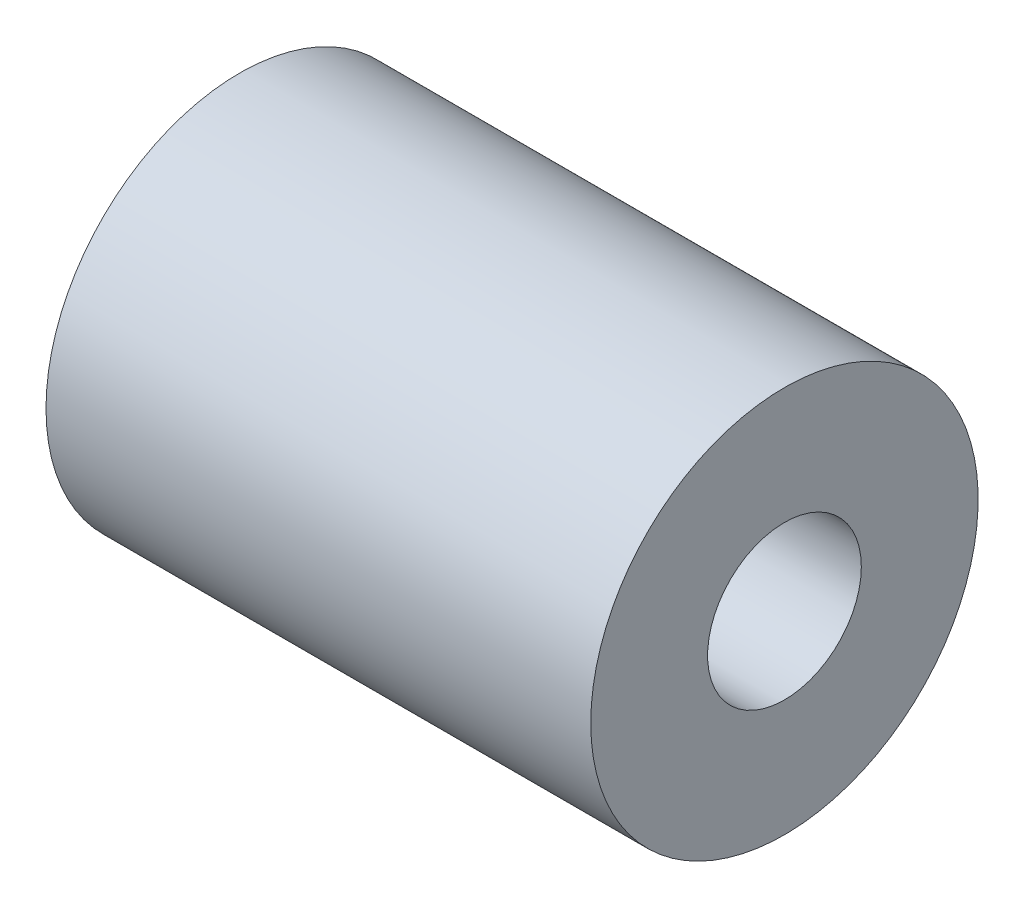
ISO-10303-21;
HEADER;
FILE_DESCRIPTION(('STEP AP214'),'2;1');
FILE_NAME('part.step','',(''),(''),'','','');
FILE_SCHEMA(('AUTOMOTIVE_DESIGN { 1 0 10303 214 1 1 1 1 }'));
ENDSEC;
DATA;
#1=APPLICATION_CONTEXT('core data for automotive mechanical design processes');
#2=APPLICATION_PROTOCOL_DEFINITION('international standard','automotive_design',2000,#1);
#3=PRODUCT_CONTEXT('',#1,'mechanical');
#4=PRODUCT('Part','Part','',(#3));
#5=PRODUCT_RELATED_PRODUCT_CATEGORY('part','',(#4));
#6=PRODUCT_DEFINITION_FORMATION('','',#4);
#7=PRODUCT_DEFINITION_CONTEXT('part definition',#1,'design');
#8=PRODUCT_DEFINITION('design','',#6,#7);
#9=PRODUCT_DEFINITION_SHAPE('','',#8);
#10=(LENGTH_UNIT() NAMED_UNIT(*) SI_UNIT(.MILLI.,.METRE.));
#11=(NAMED_UNIT(*) PLANE_ANGLE_UNIT() SI_UNIT($,.RADIAN.));
#12=(NAMED_UNIT(*) SI_UNIT($,.STERADIAN.) SOLID_ANGLE_UNIT());
#13=UNCERTAINTY_MEASURE_WITH_UNIT(LENGTH_MEASURE(1.E-05),#10,'distance_accuracy_value','');
#14=(GEOMETRIC_REPRESENTATION_CONTEXT(3) GLOBAL_UNCERTAINTY_ASSIGNED_CONTEXT((#13)) GLOBAL_UNIT_ASSIGNED_CONTEXT((#10,
#11,#12)) REPRESENTATION_CONTEXT('',''));
#15=CARTESIAN_POINT('',(0.,0.,0.));
#16=DIRECTION('',(0.,0.,1.));
#17=DIRECTION('',(1.,0.,0.));
#18=AXIS2_PLACEMENT_3D('',#15,#16,#17);
#19=CARTESIAN_POINT('',(11.25,0.,0.));
#20=DIRECTION('',(-1.,0.,0.));
#21=DIRECTION('',(0.,0.,1.));
#22=AXIS2_PLACEMENT_3D('',#19,#20,#21);
#23=CYLINDRICAL_SURFACE('',#22,2.5);
#24=CARTESIAN_POINT('',(-11.25,0.,0.));
#25=DIRECTION('',(1.,0.,0.));
#26=DIRECTION('',(0.,0.,-1.));
#27=AXIS2_PLACEMENT_3D('',#24,#25,#26);
#28=CIRCLE('',#27,2.5);
#29=CARTESIAN_POINT('',(-11.25,0.,2.5));
#30=VERTEX_POINT('',#29);
#31=EDGE_CURVE('E49',#30,#30,#28,.T.);
#32=CARTESIAN_POINT('',(-4.9,0.,0.));
#33=DIRECTION('',(1.,0.,0.));
#34=DIRECTION('',(0.,0.,-1.));
#35=AXIS2_PLACEMENT_3D('',#32,#33,#34);
#36=CIRCLE('',#35,2.5);
#37=CARTESIAN_POINT('',(-4.9,0.,2.5));
#38=VERTEX_POINT('',#37);
#39=EDGE_CURVE('E56',#38,#38,#36,.T.);
#40=CARTESIAN_POINT('',(-11.25,0.,2.5));
#41=CARTESIAN_POINT('',(-11.1838541666667,0.,2.5));
#42=CARTESIAN_POINT('',(-11.1177083333333,0.,2.5));
#43=CARTESIAN_POINT('',(-10.9854166666667,0.,2.5));
#44=CARTESIAN_POINT('',(-10.9192708333333,0.,2.5));
#45=CARTESIAN_POINT('',(-10.7869791666667,0.,2.5));
#46=CARTESIAN_POINT('',(-10.7208333333333,0.,2.5));
#47=CARTESIAN_POINT('',(-10.5885416666667,0.,2.5));
#48=CARTESIAN_POINT('',(-10.5223958333333,0.,2.5));
#49=CARTESIAN_POINT('',(-10.3901041666667,0.,2.5));
#50=CARTESIAN_POINT('',(-10.3239583333333,0.,2.5));
#51=CARTESIAN_POINT('',(-10.1916666666667,0.,2.5));
#52=CARTESIAN_POINT('',(-10.1255208333333,0.,2.5));
#53=CARTESIAN_POINT('',(-9.99322916666667,0.,2.5));
#54=CARTESIAN_POINT('',(-9.92708333333334,0.,2.5));
#55=CARTESIAN_POINT('',(-9.79479166666667,0.,2.5));
#56=CARTESIAN_POINT('',(-9.72864583333334,0.,2.5));
#57=CARTESIAN_POINT('',(-9.59635416666667,0.,2.5));
#58=CARTESIAN_POINT('',(-9.53020833333334,0.,2.5));
#59=CARTESIAN_POINT('',(-9.39791666666667,0.,2.5));
#60=CARTESIAN_POINT('',(-9.33177083333334,0.,2.5));
#61=CARTESIAN_POINT('',(-9.19947916666667,0.,2.5));
#62=CARTESIAN_POINT('',(-9.13333333333334,0.,2.5));
#63=CARTESIAN_POINT('',(-9.00104166666667,0.,2.5));
#64=CARTESIAN_POINT('',(-8.93489583333334,0.,2.5));
#65=CARTESIAN_POINT('',(-8.80260416666667,0.,2.5));
#66=CARTESIAN_POINT('',(-8.73645833333333,0.,2.5));
#67=CARTESIAN_POINT('',(-8.60416666666667,0.,2.5));
#68=CARTESIAN_POINT('',(-8.53802083333334,0.,2.5));
#69=CARTESIAN_POINT('',(-8.40572916666667,0.,2.5));
#70=CARTESIAN_POINT('',(-8.33958333333334,0.,2.5));
#71=CARTESIAN_POINT('',(-8.20729166666667,0.,2.5));
#72=CARTESIAN_POINT('',(-8.14114583333333,0.,2.5));
#73=CARTESIAN_POINT('',(-8.00885416666667,0.,2.5));
#74=CARTESIAN_POINT('',(-7.94270833333334,0.,2.5));
#75=CARTESIAN_POINT('',(-7.81041666666667,0.,2.5));
#76=CARTESIAN_POINT('',(-7.74427083333333,0.,2.5));
#77=CARTESIAN_POINT('',(-7.61197916666667,0.,2.5));
#78=CARTESIAN_POINT('',(-7.54583333333334,0.,2.5));
#79=CARTESIAN_POINT('',(-7.41354166666667,0.,2.5));
#80=CARTESIAN_POINT('',(-7.34739583333334,0.,2.5));
#81=CARTESIAN_POINT('',(-7.21510416666667,0.,2.5));
#82=CARTESIAN_POINT('',(-7.14895833333333,0.,2.5));
#83=CARTESIAN_POINT('',(-7.01666666666667,0.,2.5));
#84=CARTESIAN_POINT('',(-6.95052083333333,0.,2.5));
#85=CARTESIAN_POINT('',(-6.81822916666667,0.,2.5));
#86=CARTESIAN_POINT('',(-6.75208333333334,0.,2.5));
#87=CARTESIAN_POINT('',(-6.61979166666667,0.,2.5));
#88=CARTESIAN_POINT('',(-6.55364583333333,0.,2.5));
#89=CARTESIAN_POINT('',(-6.42135416666667,0.,2.5));
#90=CARTESIAN_POINT('',(-6.35520833333333,0.,2.5));
#91=CARTESIAN_POINT('',(-6.22291666666667,0.,2.5));
#92=CARTESIAN_POINT('',(-6.15677083333334,0.,2.5));
#93=CARTESIAN_POINT('',(-6.02447916666667,0.,2.5));
#94=CARTESIAN_POINT('',(-5.95833333333333,0.,2.5));
#95=CARTESIAN_POINT('',(-5.82604166666667,0.,2.5));
#96=CARTESIAN_POINT('',(-5.75989583333333,0.,2.5));
#97=CARTESIAN_POINT('',(-5.62760416666667,0.,2.5));
#98=CARTESIAN_POINT('',(-5.56145833333334,0.,2.5));
#99=CARTESIAN_POINT('',(-5.42916666666667,0.,2.5));
#100=CARTESIAN_POINT('',(-5.36302083333333,0.,2.5));
#101=CARTESIAN_POINT('',(-5.23072916666667,0.,2.5));
#102=CARTESIAN_POINT('',(-5.16458333333333,0.,2.5));
#103=CARTESIAN_POINT('',(-5.03229166666667,0.,2.5));
#104=CARTESIAN_POINT('',(-4.96614583333333,0.,2.5));
#105=CARTESIAN_POINT('',(-4.9,0.,2.5));
#106=B_SPLINE_CURVE_WITH_KNOTS('',3,(#40,#41,#42,#43,#44,#45,#46,#47,#48,#49,#50,#51,#52,#53,
#54,#55,#56,#57,#58,#59,#60,#61,#62,#63,#64,#65,#66,#67,#68,#69,#70,#71,#72,#73,#74,#75,#76,#77,
#78,#79,#80,#81,#82,#83,#84,#85,#86,#87,#88,#89,#90,#91,#92,#93,#94,#95,#96,#97,#98,#99,#100,
#101,#102,#103,#104,#105),.UNSPECIFIED.,.F.,.F.,(4,2,2,2,2,2,2,2,2,2,2,2,2,2,2,2,2,2,2,2,2,2,2,
2,2,2,2,2,2,2,2,2,4),(0.,0.198437499999999,0.396875000000001,0.5953125,0.793749999999999,
0.992187500000002,1.190625,1.3890625,1.5875,1.7859375,1.984375,2.1828125,2.38125,2.5796875,
2.778125,2.9765625,3.175,3.3734375,3.571875,3.7703125,3.96875,4.1671875,4.365625,4.5640625,
4.7625,4.9609375,5.159375,5.3578125,5.55625,5.7546875,5.953125,6.1515625,6.35),.UNSPECIFIED.);
#107=EDGE_CURVE('BSEAM36',#30,#38,#106,.T.);
#108=ORIENTED_EDGE('',*,*,#31,.F.);
#109=ORIENTED_EDGE('',*,*,#39,.T.);
#110=ORIENTED_EDGE('',*,*,#107,.T.);
#111=ORIENTED_EDGE('',*,*,#107,.F.);
#112=EDGE_LOOP('',(#108,#110,#109,#111));
#113=FACE_BOUND('',#112,.T.);
#114=ADVANCED_FACE('F36',(#113),#23,.F.);
#115=CARTESIAN_POINT('',(11.25,0.,0.));
#116=DIRECTION('',(1.,0.,0.));
#117=DIRECTION('',(0.,0.,-1.));
#118=AXIS2_PLACEMENT_3D('',#115,#116,#117);
#119=PLANE('',#118);
#120=CARTESIAN_POINT('',(11.25,0.,0.));
#121=DIRECTION('',(1.,0.,0.));
#122=DIRECTION('',(0.,0.,-1.));
#123=AXIS2_PLACEMENT_3D('',#120,#121,#122);
#124=CIRCLE('',#123,3.175);
#125=CARTESIAN_POINT('',(11.25,0.,-3.175));
#126=VERTEX_POINT('',#125);
#127=EDGE_CURVE('E53',#126,#126,#124,.T.);
#128=ORIENTED_EDGE('',*,*,#127,.F.);
#129=EDGE_LOOP('',(#128));
#130=FACE_BOUND('',#129,.T.);
#131=CARTESIAN_POINT('',(11.25,0.,0.));
#132=DIRECTION('',(1.,0.,0.));
#133=DIRECTION('',(0.,0.,-1.));
#134=AXIS2_PLACEMENT_3D('',#131,#132,#133);
#135=CIRCLE('',#134,8.);
#136=CARTESIAN_POINT('',(11.25,0.,8.));
#137=VERTEX_POINT('',#136);
#138=EDGE_CURVE('E11',#137,#137,#135,.T.);
#139=ORIENTED_EDGE('',*,*,#138,.T.);
#140=EDGE_LOOP('',(#139));
#141=FACE_BOUND('',#140,.T.);
#142=ADVANCED_FACE('F78',(#130,#141),#119,.T.);
#143=CARTESIAN_POINT('',(-11.25,0.,0.));
#144=DIRECTION('',(1.,0.,0.));
#145=DIRECTION('',(0.,0.,-1.));
#146=AXIS2_PLACEMENT_3D('',#143,#144,#145);
#147=PLANE('',#146);
#148=CARTESIAN_POINT('',(-11.25,0.,0.));
#149=DIRECTION('',(1.,0.,0.));
#150=DIRECTION('',(0.,0.,-1.));
#151=AXIS2_PLACEMENT_3D('',#148,#149,#150);
#152=CIRCLE('',#151,8.);
#153=CARTESIAN_POINT('',(-11.25,0.,8.));
#154=VERTEX_POINT('',#153);
#155=EDGE_CURVE('E44',#154,#154,#152,.T.);
#156=ORIENTED_EDGE('',*,*,#155,.F.);
#157=EDGE_LOOP('',(#156));
#158=FACE_BOUND('',#157,.T.);
#159=ORIENTED_EDGE('',*,*,#31,.T.);
#160=EDGE_LOOP('',(#159));
#161=FACE_BOUND('',#160,.T.);
#162=ADVANCED_FACE('F84',(#158,#161),#147,.F.);
#163=CARTESIAN_POINT('',(11.25,0.,0.));
#164=DIRECTION('',(-1.,0.,0.));
#165=DIRECTION('',(0.,0.,1.));
#166=AXIS2_PLACEMENT_3D('',#163,#164,#165);
#167=CYLINDRICAL_SURFACE('',#166,8.);
#168=CARTESIAN_POINT('',(11.25,0.,8.));
#169=CARTESIAN_POINT('',(11.015625,0.,8.));
#170=CARTESIAN_POINT('',(10.78125,0.,8.));
#171=CARTESIAN_POINT('',(10.3125,0.,8.));
#172=CARTESIAN_POINT('',(10.078125,0.,8.));
#173=CARTESIAN_POINT('',(9.609375,0.,8.));
#174=CARTESIAN_POINT('',(9.375,0.,8.));
#175=CARTESIAN_POINT('',(8.90625,0.,8.));
#176=CARTESIAN_POINT('',(8.671875,0.,8.));
#177=CARTESIAN_POINT('',(8.203125,0.,8.));
#178=CARTESIAN_POINT('',(7.96875,0.,8.));
#179=CARTESIAN_POINT('',(7.5,0.,8.));
#180=CARTESIAN_POINT('',(7.265625,0.,8.));
#181=CARTESIAN_POINT('',(6.796875,0.,8.));
#182=CARTESIAN_POINT('',(6.5625,0.,8.));
#183=CARTESIAN_POINT('',(6.09375,0.,8.));
#184=CARTESIAN_POINT('',(5.859375,0.,8.));
#185=CARTESIAN_POINT('',(5.390625,0.,8.));
#186=CARTESIAN_POINT('',(5.15625,0.,8.));
#187=CARTESIAN_POINT('',(4.6875,0.,8.));
#188=CARTESIAN_POINT('',(4.453125,0.,8.));
#189=CARTESIAN_POINT('',(3.984375,0.,8.));
#190=CARTESIAN_POINT('',(3.75,0.,8.));
#191=CARTESIAN_POINT('',(3.28125,0.,8.));
#192=CARTESIAN_POINT('',(3.046875,0.,8.));
#193=CARTESIAN_POINT('',(2.578125,0.,8.));
#194=CARTESIAN_POINT('',(2.34375,0.,8.));
#195=CARTESIAN_POINT('',(1.875,0.,8.));
#196=CARTESIAN_POINT('',(1.640625,0.,8.));
#197=CARTESIAN_POINT('',(1.171875,0.,8.));
#198=CARTESIAN_POINT('',(0.937499999999999,0.,8.));
#199=CARTESIAN_POINT('',(0.468749999999999,0.,8.));
#200=CARTESIAN_POINT('',(0.234374999999998,0.,8.));
#201=CARTESIAN_POINT('',(-0.234375000000002,0.,8.));
#202=CARTESIAN_POINT('',(-0.468750000000002,0.,8.));
#203=CARTESIAN_POINT('',(-0.937500000000003,0.,8.));
#204=CARTESIAN_POINT('',(-1.171875,0.,8.));
#205=CARTESIAN_POINT('',(-1.640625,0.,8.));
#206=CARTESIAN_POINT('',(-1.875,0.,8.));
#207=CARTESIAN_POINT('',(-2.34375,0.,8.));
#208=CARTESIAN_POINT('',(-2.578125,0.,8.));
#209=CARTESIAN_POINT('',(-3.046875,0.,8.));
#210=CARTESIAN_POINT('',(-3.28125,0.,8.));
#211=CARTESIAN_POINT('',(-3.75,0.,8.));
#212=CARTESIAN_POINT('',(-3.984375,0.,8.));
#213=CARTESIAN_POINT('',(-4.453125,0.,8.));
#214=CARTESIAN_POINT('',(-4.6875,0.,8.));
#215=CARTESIAN_POINT('',(-5.15625,0.,8.));
#216=CARTESIAN_POINT('',(-5.390625,0.,8.));
#217=CARTESIAN_POINT('',(-5.859375,0.,8.));
#218=CARTESIAN_POINT('',(-6.09375,0.,8.));
#219=CARTESIAN_POINT('',(-6.5625,0.,8.));
#220=CARTESIAN_POINT('',(-6.796875,0.,8.));
#221=CARTESIAN_POINT('',(-7.265625,0.,8.));
#222=CARTESIAN_POINT('',(-7.5,0.,8.));
#223=CARTESIAN_POINT('',(-7.96875,0.,8.));
#224=CARTESIAN_POINT('',(-8.203125,0.,8.));
#225=CARTESIAN_POINT('',(-8.671875,0.,8.));
#226=CARTESIAN_POINT('',(-8.90625,0.,8.));
#227=CARTESIAN_POINT('',(-9.375,0.,8.));
#228=CARTESIAN_POINT('',(-9.609375,0.,8.));
#229=CARTESIAN_POINT('',(-10.078125,0.,8.));
#230=CARTESIAN_POINT('',(-10.3125,0.,8.));
#231=CARTESIAN_POINT('',(-10.78125,0.,8.));
#232=CARTESIAN_POINT('',(-11.015625,0.,8.));
#233=CARTESIAN_POINT('',(-11.25,0.,8.));
#234=B_SPLINE_CURVE_WITH_KNOTS('',3,(#168,#169,#170,#171,#172,#173,#174,#175,#176,#177,#178,
#179,#180,#181,#182,#183,#184,#185,#186,#187,#188,#189,#190,#191,#192,#193,#194,#195,#196,#197,
#198,#199,#200,#201,#202,#203,#204,#205,#206,#207,#208,#209,#210,#211,#212,#213,#214,#215,#216,
#217,#218,#219,#220,#221,#222,#223,#224,#225,#226,#227,#228,#229,#230,#231,#232,#233),
.UNSPECIFIED.,.F.,.F.,(4,2,2,2,2,2,2,2,2,2,2,2,2,2,2,2,2,2,2,2,2,2,2,2,2,2,2,2,2,2,2,2,4),(0.,
0.703125000000001,1.40625,2.109375,2.8125,3.515625,4.21875,4.921875,5.625,6.328125,7.03125,
7.734375,8.4375,9.140625,9.84375,10.546875,11.25,11.953125,12.65625,13.359375,14.0625,14.765625,
15.46875,16.171875,16.875,17.578125,18.28125,18.984375,19.6875,20.390625,21.09375,21.796875,
22.5),.UNSPECIFIED.);
#235=EDGE_CURVE('BSEAM38',#137,#154,#234,.T.);
#236=ORIENTED_EDGE('',*,*,#138,.F.);
#237=ORIENTED_EDGE('',*,*,#155,.T.);
#238=ORIENTED_EDGE('',*,*,#235,.T.);
#239=ORIENTED_EDGE('',*,*,#235,.F.);
#240=EDGE_LOOP('',(#236,#238,#237,#239));
#241=FACE_BOUND('',#240,.T.);
#242=ADVANCED_FACE('F38',(#241),#167,.T.);
#243=CARTESIAN_POINT('',(0.,0.,0.));
#244=DIRECTION('',(1.,0.,0.));
#245=DIRECTION('',(0.,0.,-1.));
#246=AXIS2_PLACEMENT_3D('',#243,#244,#245);
#247=CYLINDRICAL_SURFACE('',#246,3.175);
#248=CARTESIAN_POINT('',(4.9,0.,0.));
#249=DIRECTION('',(1.,0.,0.));
#250=DIRECTION('',(0.,0.,-1.));
#251=AXIS2_PLACEMENT_3D('',#248,#249,#250);
#252=CIRCLE('',#251,3.175);
#253=CARTESIAN_POINT('',(4.9,0.,-3.175));
#254=VERTEX_POINT('',#253);
#255=EDGE_CURVE('E40',#254,#254,#252,.F.);
#256=CARTESIAN_POINT('',(4.9,0.,-3.175));
#257=CARTESIAN_POINT('',(4.96614583333333,0.,-3.175));
#258=CARTESIAN_POINT('',(5.03229166666667,0.,-3.175));
#259=CARTESIAN_POINT('',(5.16458333333333,0.,-3.175));
#260=CARTESIAN_POINT('',(5.23072916666667,0.,-3.175));
#261=CARTESIAN_POINT('',(5.36302083333333,0.,-3.175));
#262=CARTESIAN_POINT('',(5.42916666666667,0.,-3.175));
#263=CARTESIAN_POINT('',(5.56145833333333,0.,-3.175));
#264=CARTESIAN_POINT('',(5.62760416666667,0.,-3.175));
#265=CARTESIAN_POINT('',(5.75989583333333,0.,-3.175));
#266=CARTESIAN_POINT('',(5.82604166666667,0.,-3.175));
#267=CARTESIAN_POINT('',(5.95833333333333,0.,-3.175));
#268=CARTESIAN_POINT('',(6.02447916666667,0.,-3.175));
#269=CARTESIAN_POINT('',(6.15677083333333,0.,-3.175));
#270=CARTESIAN_POINT('',(6.22291666666667,0.,-3.175));
#271=CARTESIAN_POINT('',(6.35520833333333,0.,-3.175));
#272=CARTESIAN_POINT('',(6.42135416666667,0.,-3.175));
#273=CARTESIAN_POINT('',(6.55364583333333,0.,-3.175));
#274=CARTESIAN_POINT('',(6.61979166666667,0.,-3.175));
#275=CARTESIAN_POINT('',(6.75208333333333,0.,-3.175));
#276=CARTESIAN_POINT('',(6.81822916666667,0.,-3.175));
#277=CARTESIAN_POINT('',(6.95052083333333,0.,-3.175));
#278=CARTESIAN_POINT('',(7.01666666666667,0.,-3.175));
#279=CARTESIAN_POINT('',(7.14895833333333,0.,-3.175));
#280=CARTESIAN_POINT('',(7.21510416666667,0.,-3.175));
#281=CARTESIAN_POINT('',(7.34739583333333,0.,-3.175));
#282=CARTESIAN_POINT('',(7.41354166666667,0.,-3.175));
#283=CARTESIAN_POINT('',(7.54583333333333,0.,-3.175));
#284=CARTESIAN_POINT('',(7.61197916666667,0.,-3.175));
#285=CARTESIAN_POINT('',(7.74427083333333,0.,-3.175));
#286=CARTESIAN_POINT('',(7.81041666666667,0.,-3.175));
#287=CARTESIAN_POINT('',(7.94270833333333,0.,-3.175));
#288=CARTESIAN_POINT('',(8.00885416666666,0.,-3.175));
#289=CARTESIAN_POINT('',(8.14114583333333,0.,-3.175));
#290=CARTESIAN_POINT('',(8.20729166666666,0.,-3.175));
#291=CARTESIAN_POINT('',(8.33958333333333,0.,-3.175));
#292=CARTESIAN_POINT('',(8.40572916666667,0.,-3.175));
#293=CARTESIAN_POINT('',(8.53802083333333,0.,-3.175));
#294=CARTESIAN_POINT('',(8.60416666666666,0.,-3.175));
#295=CARTESIAN_POINT('',(8.73645833333333,0.,-3.175));
#296=CARTESIAN_POINT('',(8.80260416666667,0.,-3.175));
#297=CARTESIAN_POINT('',(8.93489583333333,0.,-3.175));
#298=CARTESIAN_POINT('',(9.00104166666667,0.,-3.175));
#299=CARTESIAN_POINT('',(9.13333333333333,0.,-3.175));
#300=CARTESIAN_POINT('',(9.19947916666666,0.,-3.175));
#301=CARTESIAN_POINT('',(9.33177083333333,0.,-3.175));
#302=CARTESIAN_POINT('',(9.39791666666666,0.,-3.175));
#303=CARTESIAN_POINT('',(9.53020833333333,0.,-3.175));
#304=CARTESIAN_POINT('',(9.59635416666666,0.,-3.175));
#305=CARTESIAN_POINT('',(9.72864583333333,0.,-3.175));
#306=CARTESIAN_POINT('',(9.79479166666667,0.,-3.175));
#307=CARTESIAN_POINT('',(9.92708333333333,0.,-3.175));
#308=CARTESIAN_POINT('',(9.99322916666666,0.,-3.175));
#309=CARTESIAN_POINT('',(10.1255208333333,0.,-3.175));
#310=CARTESIAN_POINT('',(10.1916666666667,0.,-3.175));
#311=CARTESIAN_POINT('',(10.3239583333333,0.,-3.175));
#312=CARTESIAN_POINT('',(10.3901041666667,0.,-3.175));
#313=CARTESIAN_POINT('',(10.5223958333333,0.,-3.175));
#314=CARTESIAN_POINT('',(10.5885416666667,0.,-3.175));
#315=CARTESIAN_POINT('',(10.7208333333333,0.,-3.175));
#316=CARTESIAN_POINT('',(10.7869791666667,0.,-3.175));
#317=CARTESIAN_POINT('',(10.9192708333333,0.,-3.175));
#318=CARTESIAN_POINT('',(10.9854166666667,0.,-3.175));
#319=CARTESIAN_POINT('',(11.1177083333333,0.,-3.175));
#320=CARTESIAN_POINT('',(11.1838541666667,0.,-3.175));
#321=CARTESIAN_POINT('',(11.25,0.,-3.175));
#322=B_SPLINE_CURVE_WITH_KNOTS('',3,(#256,#257,#258,#259,#260,#261,#262,#263,#264,#265,#266,
#267,#268,#269,#270,#271,#272,#273,#274,#275,#276,#277,#278,#279,#280,#281,#282,#283,#284,#285,
#286,#287,#288,#289,#290,#291,#292,#293,#294,#295,#296,#297,#298,#299,#300,#301,#302,#303,#304,
#305,#306,#307,#308,#309,#310,#311,#312,#313,#314,#315,#316,#317,#318,#319,#320,#321),
.UNSPECIFIED.,.F.,.F.,(4,2,2,2,2,2,2,2,2,2,2,2,2,2,2,2,2,2,2,2,2,2,2,2,2,2,2,2,2,2,2,2,4),(0.,
0.1984375,0.396875,0.5953125,0.79375,0.9921875,1.190625,1.3890625,1.5875,1.7859375,1.984375,
2.1828125,2.38125,2.5796875,2.778125,2.9765625,3.175,3.3734375,3.571875,3.7703125,3.96875,
4.1671875,4.365625,4.5640625,4.7625,4.9609375,5.159375,5.3578125,5.55625,5.7546875,5.953125,
6.1515625,6.35),.UNSPECIFIED.);
#323=EDGE_CURVE('BSEAM63',#254,#126,#322,.T.);
#324=ORIENTED_EDGE('',*,*,#255,.T.);
#325=ORIENTED_EDGE('',*,*,#127,.T.);
#326=ORIENTED_EDGE('',*,*,#323,.T.);
#327=ORIENTED_EDGE('',*,*,#323,.F.);
#328=EDGE_LOOP('',(#324,#326,#325,#327));
#329=FACE_BOUND('',#328,.T.);
#330=ADVANCED_FACE('F63',(#329),#247,.F.);
#331=CARTESIAN_POINT('',(4.9,0.,0.));
#332=DIRECTION('',(1.,0.,0.));
#333=DIRECTION('',(0.,0.,-1.));
#334=AXIS2_PLACEMENT_3D('',#331,#332,#333);
#335=PLANE('',#334);
#336=ORIENTED_EDGE('',*,*,#255,.F.);
#337=EDGE_LOOP('',(#336));
#338=FACE_BOUND('',#337,.T.);
#339=ADVANCED_FACE('F66',(#338),#335,.T.);
#340=CARTESIAN_POINT('',(-4.9,0.,0.));
#341=DIRECTION('',(1.,0.,0.));
#342=DIRECTION('',(0.,0.,-1.));
#343=AXIS2_PLACEMENT_3D('',#340,#341,#342);
#344=PLANE('',#343);
#345=ORIENTED_EDGE('',*,*,#39,.F.);
#346=EDGE_LOOP('',(#345));
#347=FACE_BOUND('',#346,.T.);
#348=ADVANCED_FACE('F68',(#347),#344,.F.);
#349=CLOSED_SHELL('',(#114,#142,#162,#242,#330,#339,#348));
#350=MANIFOLD_SOLID_BREP('B2',#349);
#351=ADVANCED_BREP_SHAPE_REPRESENTATION('',(#18,#350),#14);
#352=SHAPE_DEFINITION_REPRESENTATION(#9,#351);
ENDSEC;
END-ISO-10303-21;
